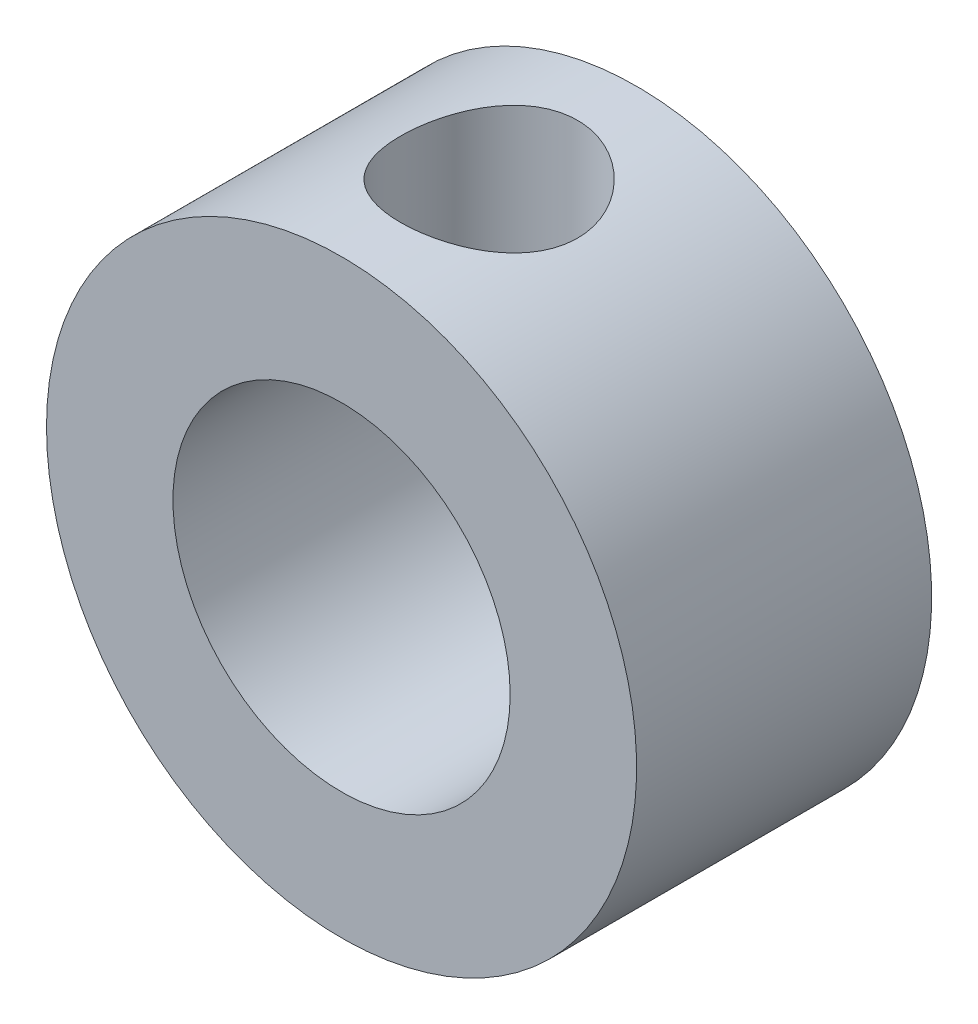
ISO-10303-21;
HEADER;
FILE_DESCRIPTION(('STEP AP214'),'2;1');
FILE_NAME('part.step','',(''),(''),'','','');
FILE_SCHEMA(('AUTOMOTIVE_DESIGN { 1 0 10303 214 1 1 1 1 }'));
ENDSEC;
DATA;
#1=APPLICATION_CONTEXT('core data for automotive mechanical design processes');
#2=APPLICATION_PROTOCOL_DEFINITION('international standard','automotive_design',2000,#1);
#3=PRODUCT_CONTEXT('',#1,'mechanical');
#4=PRODUCT('Part','Part','',(#3));
#5=PRODUCT_RELATED_PRODUCT_CATEGORY('part','',(#4));
#6=PRODUCT_DEFINITION_FORMATION('','',#4);
#7=PRODUCT_DEFINITION_CONTEXT('part definition',#1,'design');
#8=PRODUCT_DEFINITION('design','',#6,#7);
#9=PRODUCT_DEFINITION_SHAPE('','',#8);
#10=(LENGTH_UNIT() NAMED_UNIT(*) SI_UNIT(.MILLI.,.METRE.));
#11=(NAMED_UNIT(*) PLANE_ANGLE_UNIT() SI_UNIT($,.RADIAN.));
#12=(NAMED_UNIT(*) SI_UNIT($,.STERADIAN.) SOLID_ANGLE_UNIT());
#13=UNCERTAINTY_MEASURE_WITH_UNIT(LENGTH_MEASURE(1.E-05),#10,'distance_accuracy_value','');
#14=(GEOMETRIC_REPRESENTATION_CONTEXT(3) GLOBAL_UNCERTAINTY_ASSIGNED_CONTEXT((#13)) GLOBAL_UNIT_ASSIGNED_CONTEXT((#10,
#11,#12)) REPRESENTATION_CONTEXT('',''));
#15=CARTESIAN_POINT('',(0.,0.,0.));
#16=DIRECTION('',(0.,0.,1.));
#17=DIRECTION('',(1.,0.,0.));
#18=AXIS2_PLACEMENT_3D('',#15,#16,#17);
#19=CARTESIAN_POINT('',(0.,0.,7.));
#20=DIRECTION('',(0.,0.,-1.));
#21=DIRECTION('',(-1.,0.,0.));
#22=AXIS2_PLACEMENT_3D('',#19,#20,#21);
#23=CYLINDRICAL_SURFACE('',#22,7.);
#24=CARTESIAN_POINT('',(0.,7.,5.59999999999999));
#25=CARTESIAN_POINT('',(0.115204057854619,6.99999900950771,5.59999860352115));
#26=CARTESIAN_POINT('',(0.23042224569214,6.99712881971535,5.59048859092643));
#27=CARTESIAN_POINT('',(0.45750337542683,6.98595947831167,5.55279010408905));
#28=CARTESIAN_POINT('',(0.569365306175984,6.97765870745569,5.52459605876731));
#29=CARTESIAN_POINT('',(0.786425790856332,6.95653773502571,5.45055557632562));
#30=CARTESIAN_POINT('',(0.891633910153516,6.94372420350596,5.40473518253348));
#31=CARTESIAN_POINT('',(1.09287385347438,6.91490952932704,5.29684946972182));
#32=CARTESIAN_POINT('',(1.18890445445753,6.89890796268893,5.23478198964641));
#33=CARTESIAN_POINT('',(1.37182051605723,6.86491032069884,5.09428638953825));
#34=CARTESIAN_POINT('',(1.45840529974207,6.84687337119851,5.01547672375971));
#35=CARTESIAN_POINT('',(1.61734889292652,6.81108167894619,4.84454707812573));
#36=CARTESIAN_POINT('',(1.68970530858416,6.79332698414302,4.75242486302505));
#37=CARTESIAN_POINT('',(1.8197205281319,6.75967759591281,4.55494094574734));
#38=CARTESIAN_POINT('',(1.87701232631098,6.74383369329425,4.44932815461296));
#39=CARTESIAN_POINT('',(1.97289952684663,6.71641068551644,4.22941504407758));
#40=CARTESIAN_POINT('',(2.01149941887961,6.70483055638635,4.11511681850083));
#41=CARTESIAN_POINT('',(2.06782287155711,6.68767219173809,3.88445362741735));
#42=CARTESIAN_POINT('',(2.08610074728547,6.68193497054347,3.76823615859048));
#43=CARTESIAN_POINT('',(2.10299222860539,6.67663905649675,3.53425358129653));
#44=CARTESIAN_POINT('',(2.10161059865508,6.677078866648,3.41648885471728));
#45=CARTESIAN_POINT('',(2.07965768079735,6.68394641694889,3.18726252794812));
#46=CARTESIAN_POINT('',(2.05978087367758,6.69015744038797,3.07572684949287));
#47=CARTESIAN_POINT('',(2.00252388597877,6.70751698720074,2.85765229921716));
#48=CARTESIAN_POINT('',(1.96514197798296,6.71866599785291,2.75111392167594));
#49=CARTESIAN_POINT('',(1.87342437315153,6.74481826304963,2.54435951047497));
#50=CARTESIAN_POINT('',(1.81886343708498,6.75987222562333,2.44425008246264));
#51=CARTESIAN_POINT('',(1.69449311624156,6.79211381800091,2.25437516918574));
#52=CARTESIAN_POINT('',(1.62468003603623,6.80930196445788,2.16461219882072));
#53=CARTESIAN_POINT('',(1.46833807071764,6.84475415817112,1.99403933293318));
#54=CARTESIAN_POINT('',(1.38123287045375,6.86303316034697,1.91375987035847));
#55=CARTESIAN_POINT('',(1.19456856303955,6.89797141688562,1.76882442231006));
#56=CARTESIAN_POINT('',(1.09500867260523,6.91463056925774,1.70416942021981));
#57=CARTESIAN_POINT('',(0.885297053679917,6.94460424097259,1.59199610854939));
#58=CARTESIAN_POINT('',(0.775078849647124,6.9578956113564,1.54459547725021));
#59=CARTESIAN_POINT('',(0.547743581844923,6.97946930565111,1.46916057386053));
#60=CARTESIAN_POINT('',(0.43062845222541,6.98775302661799,1.44112090005453));
#61=CARTESIAN_POINT('',(0.197333139735662,6.99815710500954,1.40608695094086));
#62=CARTESIAN_POINT('',(0.0812701366416596,7.00048790584906,1.39837377987776));
#63=CARTESIAN_POINT('',(-0.150499448152737,6.99934092538464,1.40219681799693));
#64=CARTESIAN_POINT('',(-0.266206075367093,6.9958639194886,1.41373045751203));
#65=CARTESIAN_POINT('',(-0.491265047433574,6.98362975782027,1.45513845555611));
#66=CARTESIAN_POINT('',(-0.600701881659835,6.9749936171918,1.48459274261323));
#67=CARTESIAN_POINT('',(-0.813056494536327,6.95344086978149,1.56050052588949));
#68=CARTESIAN_POINT('',(-0.915973487835813,6.94052374849532,1.60695606545302));
#69=CARTESIAN_POINT('',(-1.11501206524547,6.91137516091842,1.7167544316736));
#70=CARTESIAN_POINT('',(-1.21092135667953,6.89507393161496,1.78046307732718));
#71=CARTESIAN_POINT('',(-1.3909326311722,6.86102856270093,1.92251465567394));
#72=CARTESIAN_POINT('',(-1.47503164529831,6.84328406203694,2.00086125664272));
#73=CARTESIAN_POINT('',(-1.63220042371436,6.80754440616605,2.17334223171713));
#74=CARTESIAN_POINT('',(-1.704758737241,6.78956355045859,2.26794662608057));
#75=CARTESIAN_POINT('',(-1.83300593101018,6.75607121334564,2.46837911461883));
#76=CARTESIAN_POINT('',(-1.88869525361274,6.74055966719185,2.57420691438104));
#77=CARTESIAN_POINT('',(-1.9812428597802,6.71394065458417,2.79374548775704));
#78=CARTESIAN_POINT('',(-2.01818885711814,6.70281272971451,2.90741666115297));
#79=CARTESIAN_POINT('',(-2.07230423141213,6.68628232117816,3.13976315650234));
#80=CARTESIAN_POINT('',(-2.08948038570493,6.68087787548571,3.25843674909626));
#81=CARTESIAN_POINT('',(-2.1031077827895,6.67659961459091,3.49210612574379));
#82=CARTESIAN_POINT('',(-2.10039277431119,6.67746306290277,3.60704911146919));
#83=CARTESIAN_POINT('',(-2.07630507622026,6.68499161674532,3.83475974476086));
#84=CARTESIAN_POINT('',(-2.05493313374584,6.69165648995132,3.94752747925272));
#85=CARTESIAN_POINT('',(-1.99467644326079,6.70986069172471,4.16632355878434));
#86=CARTESIAN_POINT('',(-1.95601245709972,6.72133846373454,4.27241820230217));
#87=CARTESIAN_POINT('',(-1.86244109969502,6.74786390463686,4.47669941434901));
#88=CARTESIAN_POINT('',(-1.80753061948004,6.76291225669557,4.5748844646982));
#89=CARTESIAN_POINT('',(-1.68068269327122,6.79556746998737,4.76442836313677));
#90=CARTESIAN_POINT('',(-1.60819786530196,6.81324756230006,4.85540826576425));
#91=CARTESIAN_POINT('',(-1.44924408481688,6.84881848629347,5.02418349763132));
#92=CARTESIAN_POINT('',(-1.36277150398828,6.8667093715328,5.10197539525494));
#93=CARTESIAN_POINT('',(-1.17525206705655,6.90131311199101,5.24443277721294));
#94=CARTESIAN_POINT('',(-1.07385304010685,6.91797623671995,5.30864802559765));
#95=CARTESIAN_POINT('',(-0.861197923576928,6.94764952638087,5.41902923786565));
#96=CARTESIAN_POINT('',(-0.749946474198528,6.9606613990348,5.46520364358431));
#97=CARTESIAN_POINT('',(-0.533060797717388,6.98043044957033,5.53405338591383));
#98=CARTESIAN_POINT('',(-0.428101746735922,6.98770838333498,5.55871634203653));
#99=CARTESIAN_POINT('',(-0.215432273323088,6.99749322292286,5.5916889353382));
#100=CARTESIAN_POINT('',(-0.107722313801394,7.00000092616635,5.60000130578673));
#101=CARTESIAN_POINT('',(0.,7.,5.59999999999999));
#102=B_SPLINE_CURVE_WITH_KNOTS('',3,(#24,#25,#26,#27,#28,#29,#30,#31,#32,#33,#34,#35,#36,#37,
#38,#39,#40,#41,#42,#43,#44,#45,#46,#47,#48,#49,#50,#51,#52,#53,#54,#55,#56,#57,#58,#59,#60,#61,
#62,#63,#64,#65,#66,#67,#68,#69,#70,#71,#72,#73,#74,#75,#76,#77,#78,#79,#80,#81,#82,#83,#84,#85,
#86,#87,#88,#89,#90,#91,#92,#93,#94,#95,#96,#97,#98,#99,#100,#101),.UNSPECIFIED.,.T.,.F.,(4,2,2,
2,2,2,2,2,2,2,2,2,2,2,2,2,2,2,2,2,2,2,2,2,2,2,2,2,2,2,2,2,2,2,2,2,2,2,4),(0.,0.345216485057653,
0.690535950784395,1.03534714682122,1.38020423017777,1.73397844127467,2.08781212204085,
2.44960073405751,2.81130240360511,3.16287565099236,3.51436369646723,3.85316423376744,
4.19199821121199,4.53547397025965,4.87903304221975,5.2369394566743,5.59486839143497,
5.9551946563436,6.31542034940327,6.66272333213959,7.00997994970453,7.34939445355253,
7.68884976431215,8.03615827984067,8.38355394800262,8.74356560451941,9.10356781953747,
9.46186940931747,9.8200481324439,10.1633021765697,10.5065424753262,10.8455205657019,
11.1845635658073,11.5359569595828,11.8874416486288,12.2492019462572,12.6107927623971,
12.9336436870902,13.256440637348),.UNSPECIFIED.);
#103=CARTESIAN_POINT('',(0.,7.,5.59999999999999));
#104=VERTEX_POINT('',#103);
#105=EDGE_CURVE('E51',#104,#104,#102,.T.);
#106=ORIENTED_EDGE('',*,*,#105,.F.);
#107=EDGE_LOOP('',(#106));
#108=FACE_BOUND('',#107,.T.);
#109=CARTESIAN_POINT('',(0.,0.,7.));
#110=DIRECTION('',(0.,0.,-1.));
#111=DIRECTION('',(-1.,0.,0.));
#112=AXIS2_PLACEMENT_3D('',#109,#110,#111);
#113=CIRCLE('',#112,7.);
#114=CARTESIAN_POINT('',(-7.,0.,7.));
#115=VERTEX_POINT('',#114);
#116=EDGE_CURVE('E10',#115,#115,#113,.T.);
#117=ORIENTED_EDGE('',*,*,#116,.T.);
#118=EDGE_LOOP('',(#117));
#119=FACE_BOUND('',#118,.T.);
#120=CARTESIAN_POINT('',(0.,0.,0.));
#121=DIRECTION('',(0.,0.,-1.));
#122=DIRECTION('',(-1.,0.,0.));
#123=AXIS2_PLACEMENT_3D('',#120,#121,#122);
#124=CIRCLE('',#123,7.);
#125=CARTESIAN_POINT('',(-7.,0.,0.));
#126=VERTEX_POINT('',#125);
#127=EDGE_CURVE('E38',#126,#126,#124,.T.);
#128=ORIENTED_EDGE('',*,*,#127,.F.);
#129=EDGE_LOOP('',(#128));
#130=FACE_BOUND('',#129,.T.);
#131=ADVANCED_FACE('F31',(#108,#119,#130),#23,.T.);
#132=CARTESIAN_POINT('',(7.,0.,7.));
#133=DIRECTION('',(0.,0.,1.));
#134=DIRECTION('',(1.,0.,0.));
#135=AXIS2_PLACEMENT_3D('',#132,#133,#134);
#136=PLANE('',#135);
#137=CARTESIAN_POINT('',(0.,0.,7.));
#138=DIRECTION('',(0.,0.,1.));
#139=DIRECTION('',(1.,0.,0.));
#140=AXIS2_PLACEMENT_3D('',#137,#138,#139);
#141=CIRCLE('',#140,3.99999999999999);
#142=CARTESIAN_POINT('',(3.99999999999999,0.,7.));
#143=VERTEX_POINT('',#142);
#144=EDGE_CURVE('E46',#143,#143,#141,.T.);
#145=ORIENTED_EDGE('',*,*,#144,.F.);
#146=EDGE_LOOP('',(#145));
#147=FACE_BOUND('',#146,.T.);
#148=ORIENTED_EDGE('',*,*,#116,.F.);
#149=EDGE_LOOP('',(#148));
#150=FACE_BOUND('',#149,.T.);
#151=ADVANCED_FACE('F74',(#147,#150),#136,.T.);
#152=CARTESIAN_POINT('',(0.,0.,0.));
#153=DIRECTION('',(0.,0.,-1.));
#154=DIRECTION('',(-1.,0.,0.));
#155=AXIS2_PLACEMENT_3D('',#152,#153,#154);
#156=PLANE('',#155);
#157=CARTESIAN_POINT('',(0.,0.,0.));
#158=DIRECTION('',(0.,0.,1.));
#159=DIRECTION('',(1.,0.,0.));
#160=AXIS2_PLACEMENT_3D('',#157,#158,#159);
#161=CIRCLE('',#160,3.99999999999999);
#162=CARTESIAN_POINT('',(3.99999999999999,0.,0.));
#163=VERTEX_POINT('',#162);
#164=EDGE_CURVE('E42',#163,#163,#161,.T.);
#165=ORIENTED_EDGE('',*,*,#164,.T.);
#166=EDGE_LOOP('',(#165));
#167=FACE_BOUND('',#166,.T.);
#168=ORIENTED_EDGE('',*,*,#127,.T.);
#169=EDGE_LOOP('',(#168));
#170=FACE_BOUND('',#169,.T.);
#171=ADVANCED_FACE('F71',(#167,#170),#156,.T.);
#172=CARTESIAN_POINT('',(0.,0.,7.));
#173=DIRECTION('',(0.,0.,1.));
#174=DIRECTION('',(1.,0.,0.));
#175=AXIS2_PLACEMENT_3D('',#172,#173,#174);
#176=CYLINDRICAL_SURFACE('',#175,3.99999999999999);
#177=CARTESIAN_POINT('',(0.,3.99999999999999,5.59999999999999));
#178=CARTESIAN_POINT('',(0.109725239522175,3.99999264287856,5.59999149182401));
#179=CARTESIAN_POINT('',(0.219566121797985,3.99543735627816,5.59134922217852));
#180=CARTESIAN_POINT('',(0.435956332853301,3.97766056559726,5.55717948516371));
#181=CARTESIAN_POINT('',(0.542499967026168,3.96442485872987,5.53162434455592));
#182=CARTESIAN_POINT('',(0.748847767256634,3.93066356262106,5.46492682041998));
#183=CARTESIAN_POINT('',(0.848677088492017,3.9101672216118,5.42384693196482));
#184=CARTESIAN_POINT('',(1.0398542926017,3.86372814833452,5.32761268026999));
#185=CARTESIAN_POINT('',(1.13120230734358,3.83778550076628,5.27245853590724));
#186=CARTESIAN_POINT('',(1.30947182891694,3.78081963010102,5.14560480379));
#187=CARTESIAN_POINT('',(1.39572427915895,3.74957626333629,5.07306544943578));
#188=CARTESIAN_POINT('',(1.55546505007128,3.68618069665243,4.91532568390627));
#189=CARTESIAN_POINT('',(1.62894256542358,3.65402775386037,4.83011466668523));
#190=CARTESIAN_POINT('',(1.76753210720386,3.58917602274784,4.64052416418153));
#191=CARTESIAN_POINT('',(1.83134596949795,3.55667651133238,4.53511911137416));
#192=CARTESIAN_POINT('',(1.94007800952199,3.49855992208215,4.31322101259494));
#193=CARTESIAN_POINT('',(1.98501055983616,3.47293761465965,4.19673648353417));
#194=CARTESIAN_POINT('',(2.05162778973322,3.43398312295476,3.9632691019904));
#195=CARTESIAN_POINT('',(2.07458133375182,3.41998733122416,3.84676509569801));
#196=CARTESIAN_POINT('',(2.10042065774089,3.40418721984816,3.61079196134465));
#197=CARTESIAN_POINT('',(2.1033302560727,3.402368430258,3.49132652193647));
#198=CARTESIAN_POINT('',(2.08992575686747,3.41060563138388,3.27023585900601));
#199=CARTESIAN_POINT('',(2.07615752002025,3.41908939649749,3.16838235315366));
#200=CARTESIAN_POINT('',(2.03424482005421,3.44418916575292,2.96871985136041));
#201=CARTESIAN_POINT('',(2.00609491145431,3.460808250155,2.87091240259461));
#202=CARTESIAN_POINT('',(1.93576201725034,3.50064017337878,2.67933944133553));
#203=CARTESIAN_POINT('',(1.89327386515965,3.523994639943,2.58571682638859));
#204=CARTESIAN_POINT('',(1.79571666755296,3.57469177714185,2.40646125445991));
#205=CARTESIAN_POINT('',(1.74064200304352,3.60203622704667,2.32083189002303));
#206=CARTESIAN_POINT('',(1.61039398180521,3.66230444404027,2.14721957759018));
#207=CARTESIAN_POINT('',(1.53347842501706,3.69546972830904,2.06062273053431));
#208=CARTESIAN_POINT('',(1.36616462781175,3.76053926987167,1.90094507949335));
#209=CARTESIAN_POINT('',(1.27575868558246,3.79244279356362,1.82787205014573));
#210=CARTESIAN_POINT('',(1.07766804032998,3.853563532607,1.69341787931536));
#211=CARTESIAN_POINT('',(0.969298919443494,3.88252998474474,1.63292153118832));
#212=CARTESIAN_POINT('',(0.742023442184859,3.93228772595724,1.53153732928502));
#213=CARTESIAN_POINT('',(0.623126340783865,3.95308610970454,1.49063245181351));
#214=CARTESIAN_POINT('',(0.389396974626689,3.98258734426179,1.43322732089387));
#215=CARTESIAN_POINT('',(0.275130823094223,3.992195077283,1.41489309071681));
#216=CARTESIAN_POINT('',(0.044760866675094,4.00140669767391,1.39730685099087));
#217=CARTESIAN_POINT('',(-0.0713418920738998,4.00101608864391,1.39804434338994));
#218=CARTESIAN_POINT('',(-0.291279078552974,3.99076728683618,1.41762725788289));
#219=CARTESIAN_POINT('',(-0.395299675486031,3.98173859499712,1.43488622954969));
#220=CARTESIAN_POINT('',(-0.598728182196226,3.95626547527307,1.4844387504391));
#221=CARTESIAN_POINT('',(-0.698135604042716,3.93982026491347,1.51673388605336));
#222=CARTESIAN_POINT('',(-0.89255332732772,3.90044221082325,1.59614425381874));
#223=CARTESIAN_POINT('',(-0.987382033379103,3.87735176388226,1.64362307426732));
#224=CARTESIAN_POINT('',(-1.1680115660273,3.82682103032806,1.75161917503483));
#225=CARTESIAN_POINT('',(-1.25380875133066,3.79937900035165,1.81214168451701));
#226=CARTESIAN_POINT('',(-1.42355402164765,3.73930849945051,1.95183455389138));
#227=CARTESIAN_POINT('',(-1.50635375236174,3.70643824529687,2.03229813881506));
#228=CARTESIAN_POINT('',(-1.65784945462857,3.6412020641859,2.20585137885725));
#229=CARTESIAN_POINT('',(-1.72653319455465,3.60883659688131,2.298951868959));
#230=CARTESIAN_POINT('',(-1.85197407713202,3.54618291275875,2.50233559015912));
#231=CARTESIAN_POINT('',(-1.907720584217,3.51615003477915,2.61332823562711));
#232=CARTESIAN_POINT('',(-1.99916377433975,3.46498558301668,2.84516122596434));
#233=CARTESIAN_POINT('',(-2.03488847416354,3.44384158132138,2.96598753776114));
#234=CARTESIAN_POINT('',(-2.08179228794019,3.41567335738196,3.20149049526115));
#235=CARTESIAN_POINT('',(-2.09503212797938,3.40746939702879,3.31561103123257));
#236=CARTESIAN_POINT('',(-2.10264402498694,3.40278132518372,3.54469308443813));
#237=CARTESIAN_POINT('',(-2.09702755352025,3.4062900880456,3.6596540479175));
#238=CARTESIAN_POINT('',(-2.06905731966411,3.42333280060866,3.87316961432223));
#239=CARTESIAN_POINT('',(-2.04869586578453,3.43567151061489,3.97209433551285));
#240=CARTESIAN_POINT('',(-1.99445953447467,3.46743607984359,4.16496081401225));
#241=CARTESIAN_POINT('',(-1.96057985676336,3.4868644563759,4.25890078781238));
#242=CARTESIAN_POINT('',(-1.8778270800915,3.53215539501752,4.44599660125696));
#243=CARTESIAN_POINT('',(-1.8281169720611,3.55835615136983,4.53869769157732));
#244=CARTESIAN_POINT('',(-1.71597189148521,3.61377283019221,4.71506230921822));
#245=CARTESIAN_POINT('',(-1.65353007488422,3.64299037017671,4.79872093850825));
#246=CARTESIAN_POINT('',(-1.50756499361577,3.70599460661239,4.9667236471341));
#247=CARTESIAN_POINT('',(-1.42231898680451,3.73985298438167,5.04955350976632));
#248=CARTESIAN_POINT('',(-1.23839127080789,3.8047226129078,5.2001573919456));
#249=CARTESIAN_POINT('',(-1.13970134446325,3.83573210281285,5.26792213623382));
#250=CARTESIAN_POINT('',(-0.928722586410788,3.89224463430731,5.38743364904117));
#251=CARTESIAN_POINT('',(-0.816206474636302,3.91762876470985,5.43884301060635));
#252=CARTESIAN_POINT('',(-0.641101799511677,3.94873745727714,5.50070791315572));
#253=CARTESIAN_POINT('',(-0.581718321049471,3.95794212176883,5.51878135698883));
#254=CARTESIAN_POINT('',(-0.461272845180562,3.97377707651404,5.54965439112676));
#255=CARTESIAN_POINT('',(-0.400211824286286,3.98040883184998,5.5624569830487));
#256=CARTESIAN_POINT('',(-0.282777177199968,3.99038534961524,5.58164251076546));
#257=CARTESIAN_POINT('',(-0.226504746010373,3.99398117175068,5.58851710911177));
#258=CARTESIAN_POINT('',(-0.113498532604899,3.99879042332402,5.59769809925702));
#259=CARTESIAN_POINT('',(-0.0567647413745308,4.00000380609872,5.60000440157989));
#260=CARTESIAN_POINT('',(0.,3.99999999999999,5.59999999999999));
#261=B_SPLINE_CURVE_WITH_KNOTS('',3,(#177,#178,#179,#180,#181,#182,#183,#184,#185,#186,#187,
#188,#189,#190,#191,#192,#193,#194,#195,#196,#197,#198,#199,#200,#201,#202,#203,#204,#205,#206,
#207,#208,#209,#210,#211,#212,#213,#214,#215,#216,#217,#218,#219,#220,#221,#222,#223,#224,#225,
#226,#227,#228,#229,#230,#231,#232,#233,#234,#235,#236,#237,#238,#239,#240,#241,#242,#243,#244,
#245,#246,#247,#248,#249,#250,#251,#252,#253,#254,#255,#256,#257,#258,#259,#260),.UNSPECIFIED.,
.T.,.F.,(4,2,2,2,2,2,2,2,2,2,2,2,2,2,2,2,2,2,2,2,2,2,2,2,2,2,2,2,2,2,2,2,2,2,2,2,2,2,2,2,2,4),
(0.,0.328955388056856,0.65845035580953,0.986632826787792,1.31481019432104,1.66422610127768,
2.01393612903031,2.39430542275379,2.77438464995626,3.13089429519633,3.4869802243337,
3.79492330354657,4.10298306894289,4.41806287071789,4.73328360921354,5.09317488258758,
5.45327241364167,5.83355153918033,6.21349962504735,6.55994297045681,6.9061956197819,
7.22222027001747,7.53827827001644,7.86255611827308,8.18696421086289,8.5455701961971,
8.90448561862081,9.28577946390596,9.66653841880972,10.0100186118085,10.3532898805347,
10.6572136356426,10.9612454093543,11.2851996834104,11.6093285635883,11.9784125341218,
12.347723115996,12.7242211787441,12.9122308814786,13.10013336884,13.2703102751049,
13.4404905144748),.UNSPECIFIED.);
#262=CARTESIAN_POINT('',(0.,3.99999999999999,5.59999999999999));
#263=VERTEX_POINT('',#262);
#264=EDGE_CURVE('E57',#263,#263,#261,.T.);
#265=ORIENTED_EDGE('',*,*,#264,.T.);
#266=EDGE_LOOP('',(#265));
#267=FACE_BOUND('',#266,.T.);
#268=ORIENTED_EDGE('',*,*,#164,.F.);
#269=EDGE_LOOP('',(#268));
#270=FACE_BOUND('',#269,.T.);
#271=ORIENTED_EDGE('',*,*,#144,.T.);
#272=EDGE_LOOP('',(#271));
#273=FACE_BOUND('',#272,.T.);
#274=ADVANCED_FACE('F64',(#267,#270,#273),#176,.F.);
#275=CARTESIAN_POINT('',(0.,7.,3.5));
#276=DIRECTION('',(0.,1.,0.));
#277=DIRECTION('',(0.,0.,1.));
#278=AXIS2_PLACEMENT_3D('',#275,#276,#277);
#279=CYLINDRICAL_SURFACE('',#278,2.09999999999999);
#280=ORIENTED_EDGE('',*,*,#105,.T.);
#281=EDGE_LOOP('',(#280));
#282=FACE_BOUND('',#281,.T.);
#283=ORIENTED_EDGE('',*,*,#264,.F.);
#284=EDGE_LOOP('',(#283));
#285=FACE_BOUND('',#284,.T.);
#286=ADVANCED_FACE('F61',(#282,#285),#279,.F.);
#287=CLOSED_SHELL('',(#131,#151,#171,#274,#286));
#288=MANIFOLD_SOLID_BREP('B2',#287);
#289=ADVANCED_BREP_SHAPE_REPRESENTATION('',(#18,#288),#14);
#290=SHAPE_DEFINITION_REPRESENTATION(#9,#289);
ENDSEC;
END-ISO-10303-21;
